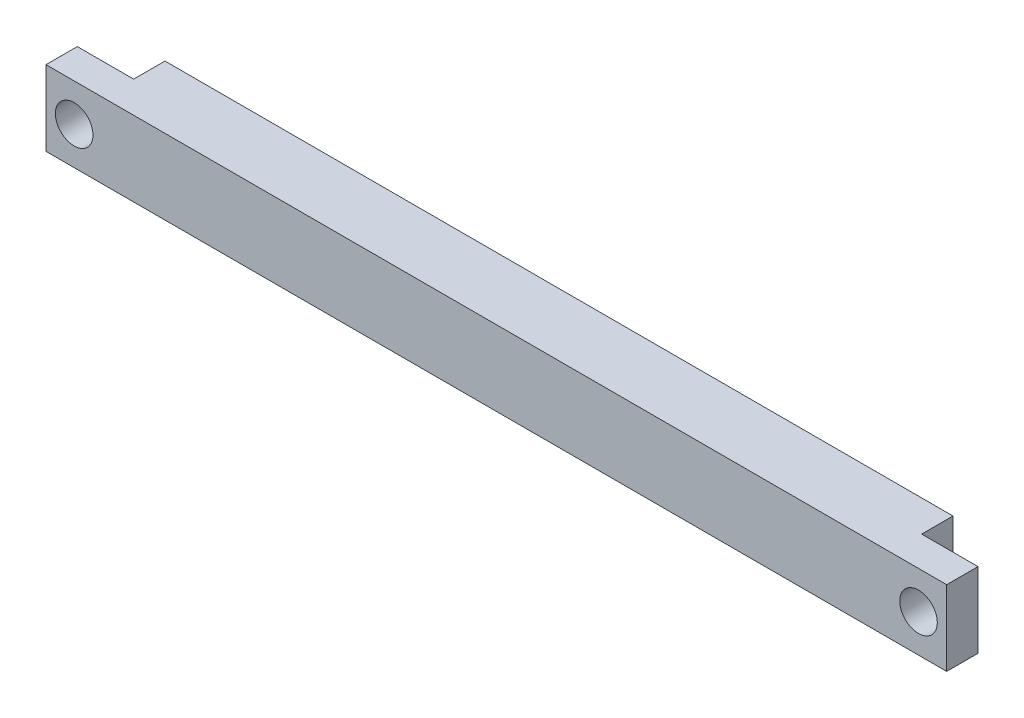
ISO-10303-21;
HEADER;
FILE_DESCRIPTION(('STEP AP214'),'2;1');
FILE_NAME('part.step','',(''),(''),'','','');
FILE_SCHEMA(('AUTOMOTIVE_DESIGN { 1 0 10303 214 1 1 1 1 }'));
ENDSEC;
DATA;
#1=APPLICATION_CONTEXT('core data for automotive mechanical design processes');
#2=APPLICATION_PROTOCOL_DEFINITION('international standard','automotive_design',2000,#1);
#3=PRODUCT_CONTEXT('',#1,'mechanical');
#4=PRODUCT('Part','Part','',(#3));
#5=PRODUCT_RELATED_PRODUCT_CATEGORY('part','',(#4));
#6=PRODUCT_DEFINITION_FORMATION('','',#4);
#7=PRODUCT_DEFINITION_CONTEXT('part definition',#1,'design');
#8=PRODUCT_DEFINITION('design','',#6,#7);
#9=PRODUCT_DEFINITION_SHAPE('','',#8);
#10=(LENGTH_UNIT() NAMED_UNIT(*) SI_UNIT(.MILLI.,.METRE.));
#11=(NAMED_UNIT(*) PLANE_ANGLE_UNIT() SI_UNIT($,.RADIAN.));
#12=(NAMED_UNIT(*) SI_UNIT($,.STERADIAN.) SOLID_ANGLE_UNIT());
#13=UNCERTAINTY_MEASURE_WITH_UNIT(LENGTH_MEASURE(1.E-05),#10,'distance_accuracy_value','');
#14=(GEOMETRIC_REPRESENTATION_CONTEXT(3) GLOBAL_UNCERTAINTY_ASSIGNED_CONTEXT((#13)) GLOBAL_UNIT_ASSIGNED_CONTEXT((#10,
#11,#12)) REPRESENTATION_CONTEXT('',''));
#15=CARTESIAN_POINT('',(0.,0.,0.));
#16=DIRECTION('',(0.,0.,1.));
#17=DIRECTION('',(1.,0.,0.));
#18=AXIS2_PLACEMENT_3D('',#15,#16,#17);
#19=CARTESIAN_POINT('',(0.,0.,0.));
#20=DIRECTION('',(0.,0.,-1.));
#21=DIRECTION('',(-1.,0.,0.));
#22=AXIS2_PLACEMENT_3D('',#19,#20,#21);
#23=PLANE('',#22);
#24=DIRECTION('',(0.,-1.,0.));
#25=VECTOR('',#24,1.);
#26=CARTESIAN_POINT('',(0.,6.,0.));
#27=LINE('',#26,#25);
#28=CARTESIAN_POINT('',(0.,6.,0.));
#29=VERTEX_POINT('',#28);
#30=CARTESIAN_POINT('',(0.,0.,0.));
#31=VERTEX_POINT('',#30);
#32=EDGE_CURVE('E132',#29,#31,#27,.T.);
#33=ORIENTED_EDGE('',*,*,#32,.F.);
#34=DIRECTION('',(-1.,0.,0.));
#35=VECTOR('',#34,1.);
#36=CARTESIAN_POINT('',(-67.4302989722411,6.,0.));
#37=LINE('',#36,#35);
#38=CARTESIAN_POINT('',(4.5,6.,0.));
#39=VERTEX_POINT('',#38);
#40=EDGE_CURVE('E162',#39,#29,#37,.T.);
#41=ORIENTED_EDGE('',*,*,#40,.F.);
#42=DIRECTION('',(0.,1.,0.));
#43=VECTOR('',#42,1.);
#44=CARTESIAN_POINT('',(4.5,0.,0.));
#45=LINE('',#44,#43);
#46=CARTESIAN_POINT('',(4.5,0.,0.));
#47=VERTEX_POINT('',#46);
#48=EDGE_CURVE('E178',#47,#39,#45,.T.);
#49=ORIENTED_EDGE('',*,*,#48,.F.);
#50=DIRECTION('',(1.,0.,0.));
#51=VECTOR('',#50,1.);
#52=CARTESIAN_POINT('',(-67.4302989722411,0.,0.));
#53=LINE('',#52,#51);
#54=EDGE_CURVE('E59',#31,#47,#53,.T.);
#55=ORIENTED_EDGE('',*,*,#54,.F.);
#56=EDGE_LOOP('',(#33,#41,#49,#55));
#57=FACE_BOUND('',#56,.T.);
#58=CARTESIAN_POINT('',(2.25,3.,0.));
#59=DIRECTION('',(0.,0.,1.));
#60=DIRECTION('',(1.,0.,0.));
#61=AXIS2_PLACEMENT_3D('',#58,#59,#60);
#62=CIRCLE('',#61,1.5);
#63=CARTESIAN_POINT('',(3.75,3.,0.));
#64=VERTEX_POINT('',#63);
#65=EDGE_CURVE('E145',#64,#64,#62,.T.);
#66=ORIENTED_EDGE('',*,*,#65,.T.);
#67=EDGE_LOOP('',(#66));
#68=FACE_BOUND('',#67,.T.);
#69=ADVANCED_FACE('F43',(#57,#68),#23,.T.);
#70=CARTESIAN_POINT('',(-67.4302989722411,0.,2.5));
#71=DIRECTION('',(1.,0.,0.));
#72=DIRECTION('',(0.,0.,-1.));
#73=AXIS2_PLACEMENT_3D('',#70,#71,#72);
#74=PLANE('',#73);
#75=DIRECTION('',(0.,-1.,0.));
#76=VECTOR('',#75,1.);
#77=CARTESIAN_POINT('',(-67.4302989722411,0.,0.));
#78=LINE('',#77,#76);
#79=CARTESIAN_POINT('',(-67.4302989722411,6.,0.));
#80=VERTEX_POINT('',#79);
#81=CARTESIAN_POINT('',(-67.4302989722411,0.,0.));
#82=VERTEX_POINT('',#81);
#83=EDGE_CURVE('E149',#80,#82,#78,.T.);
#84=ORIENTED_EDGE('',*,*,#83,.T.);
#85=DIRECTION('',(0.,0.,-1.));
#86=VECTOR('',#85,1.);
#87=CARTESIAN_POINT('',(-67.4302989722411,0.,2.5));
#88=LINE('',#87,#86);
#89=CARTESIAN_POINT('',(-67.4302989722411,0.,2.5));
#90=VERTEX_POINT('',#89);
#91=EDGE_CURVE('E11',#90,#82,#88,.T.);
#92=ORIENTED_EDGE('',*,*,#91,.F.);
#93=DIRECTION('',(0.,-1.,0.));
#94=VECTOR('',#93,1.);
#95=CARTESIAN_POINT('',(-67.4302989722411,0.,2.5));
#96=LINE('',#95,#94);
#97=CARTESIAN_POINT('',(-67.4302989722411,6.,2.5));
#98=VERTEX_POINT('',#97);
#99=EDGE_CURVE('E157',#98,#90,#96,.T.);
#100=ORIENTED_EDGE('',*,*,#99,.F.);
#101=DIRECTION('',(0.,0.,-1.));
#102=VECTOR('',#101,1.);
#103=CARTESIAN_POINT('',(-67.4302989722411,6.,2.5));
#104=LINE('',#103,#102);
#105=EDGE_CURVE('E171',#98,#80,#104,.T.);
#106=ORIENTED_EDGE('',*,*,#105,.T.);
#107=EDGE_LOOP('',(#84,#92,#100,#106));
#108=FACE_BOUND('',#107,.T.);
#109=ADVANCED_FACE('F45',(#108),#74,.F.);
#110=CARTESIAN_POINT('',(-67.4302989722411,0.,2.5));
#111=DIRECTION('',(0.,1.,0.));
#112=DIRECTION('',(0.,0.,1.));
#113=AXIS2_PLACEMENT_3D('',#110,#111,#112);
#114=PLANE('',#113);
#115=CARTESIAN_POINT('',(-62.9302989722411,0.,0.));
#116=VERTEX_POINT('',#115);
#117=EDGE_CURVE('E175',#82,#116,#53,.T.);
#118=ORIENTED_EDGE('',*,*,#117,.T.);
#119=DIRECTION('',(0.,0.,1.));
#120=VECTOR('',#119,1.);
#121=CARTESIAN_POINT('',(-62.9302989722411,0.,-2.5));
#122=LINE('',#121,#120);
#123=CARTESIAN_POINT('',(-62.9302989722411,0.,-2.5));
#124=VERTEX_POINT('',#123);
#125=EDGE_CURVE('E115',#124,#116,#122,.T.);
#126=ORIENTED_EDGE('',*,*,#125,.F.);
#127=DIRECTION('',(-1.,0.,0.));
#128=VECTOR('',#127,1.);
#129=CARTESIAN_POINT('',(0.,0.,-2.5));
#130=LINE('',#129,#128);
#131=CARTESIAN_POINT('',(0.,0.,-2.5));
#132=VERTEX_POINT('',#131);
#133=EDGE_CURVE('E108',#132,#124,#130,.T.);
#134=ORIENTED_EDGE('',*,*,#133,.F.);
#135=DIRECTION('',(0.,0.,1.));
#136=VECTOR('',#135,1.);
#137=CARTESIAN_POINT('',(0.,0.,-2.5));
#138=LINE('',#137,#136);
#139=EDGE_CURVE('E112',#132,#31,#138,.T.);
#140=ORIENTED_EDGE('',*,*,#139,.T.);
#141=ORIENTED_EDGE('',*,*,#54,.T.);
#142=DIRECTION('',(0.,0.,-1.));
#143=VECTOR('',#142,1.);
#144=CARTESIAN_POINT('',(4.5,0.,2.5));
#145=LINE('',#144,#143);
#146=CARTESIAN_POINT('',(4.5,0.,2.5));
#147=VERTEX_POINT('',#146);
#148=EDGE_CURVE('E52',#147,#47,#145,.T.);
#149=ORIENTED_EDGE('',*,*,#148,.F.);
#150=DIRECTION('',(1.,0.,0.));
#151=VECTOR('',#150,1.);
#152=CARTESIAN_POINT('',(-67.4302989722411,0.,2.5));
#153=LINE('',#152,#151);
#154=EDGE_CURVE('E161',#90,#147,#153,.T.);
#155=ORIENTED_EDGE('',*,*,#154,.F.);
#156=ORIENTED_EDGE('',*,*,#91,.T.);
#157=EDGE_LOOP('',(#118,#126,#134,#140,#141,#149,#155,#156));
#158=FACE_BOUND('',#157,.T.);
#159=ADVANCED_FACE('F110',(#158),#114,.F.);
#160=CARTESIAN_POINT('',(4.5,0.,2.5));
#161=DIRECTION('',(-1.,0.,0.));
#162=DIRECTION('',(0.,0.,1.));
#163=AXIS2_PLACEMENT_3D('',#160,#161,#162);
#164=PLANE('',#163);
#165=ORIENTED_EDGE('',*,*,#48,.T.);
#166=DIRECTION('',(0.,0.,-1.));
#167=VECTOR('',#166,1.);
#168=CARTESIAN_POINT('',(4.5,6.,2.5));
#169=LINE('',#168,#167);
#170=CARTESIAN_POINT('',(4.5,6.,2.5));
#171=VERTEX_POINT('',#170);
#172=EDGE_CURVE('E188',#171,#39,#169,.T.);
#173=ORIENTED_EDGE('',*,*,#172,.F.);
#174=DIRECTION('',(0.,1.,0.));
#175=VECTOR('',#174,1.);
#176=CARTESIAN_POINT('',(4.5,0.,2.5));
#177=LINE('',#176,#175);
#178=EDGE_CURVE('E165',#147,#171,#177,.T.);
#179=ORIENTED_EDGE('',*,*,#178,.F.);
#180=ORIENTED_EDGE('',*,*,#148,.T.);
#181=EDGE_LOOP('',(#165,#173,#179,#180));
#182=FACE_BOUND('',#181,.T.);
#183=ADVANCED_FACE('F196',(#182),#164,.F.);
#184=CARTESIAN_POINT('',(-67.4302989722411,6.,2.5));
#185=DIRECTION('',(0.,-1.,0.));
#186=DIRECTION('',(0.,0.,-1.));
#187=AXIS2_PLACEMENT_3D('',#184,#185,#186);
#188=PLANE('',#187);
#189=ORIENTED_EDGE('',*,*,#40,.T.);
#190=DIRECTION('',(0.,0.,1.));
#191=VECTOR('',#190,1.);
#192=CARTESIAN_POINT('',(0.,6.,-2.5));
#193=LINE('',#192,#191);
#194=CARTESIAN_POINT('',(0.,6.,-2.5));
#195=VERTEX_POINT('',#194);
#196=EDGE_CURVE('E202',#195,#29,#193,.T.);
#197=ORIENTED_EDGE('',*,*,#196,.F.);
#198=DIRECTION('',(1.,0.,0.));
#199=VECTOR('',#198,1.);
#200=CARTESIAN_POINT('',(0.,6.,-2.5));
#201=LINE('',#200,#199);
#202=CARTESIAN_POINT('',(-62.9302989722411,6.,-2.5));
#203=VERTEX_POINT('',#202);
#204=EDGE_CURVE('E125',#203,#195,#201,.T.);
#205=ORIENTED_EDGE('',*,*,#204,.F.);
#206=DIRECTION('',(0.,0.,1.));
#207=VECTOR('',#206,1.);
#208=CARTESIAN_POINT('',(-62.9302989722411,6.,-2.5));
#209=LINE('',#208,#207);
#210=CARTESIAN_POINT('',(-62.9302989722411,6.,0.));
#211=VERTEX_POINT('',#210);
#212=EDGE_CURVE('E141',#203,#211,#209,.T.);
#213=ORIENTED_EDGE('',*,*,#212,.T.);
#214=EDGE_CURVE('E181',#211,#80,#37,.T.);
#215=ORIENTED_EDGE('',*,*,#214,.T.);
#216=ORIENTED_EDGE('',*,*,#105,.F.);
#217=DIRECTION('',(-1.,0.,0.));
#218=VECTOR('',#217,1.);
#219=CARTESIAN_POINT('',(-67.4302989722411,6.,2.5));
#220=LINE('',#219,#218);
#221=EDGE_CURVE('E168',#171,#98,#220,.T.);
#222=ORIENTED_EDGE('',*,*,#221,.F.);
#223=ORIENTED_EDGE('',*,*,#172,.T.);
#224=EDGE_LOOP('',(#189,#197,#205,#213,#215,#216,#222,#223));
#225=FACE_BOUND('',#224,.T.);
#226=ADVANCED_FACE('F201',(#225),#188,.F.);
#227=CARTESIAN_POINT('',(0.,0.,2.5));
#228=DIRECTION('',(0.,0.,-1.));
#229=DIRECTION('',(-1.,0.,0.));
#230=AXIS2_PLACEMENT_3D('',#227,#228,#229);
#231=PLANE('',#230);
#232=CARTESIAN_POINT('',(2.25,3.,2.5));
#233=DIRECTION('',(0.,0.,1.));
#234=DIRECTION('',(1.,0.,0.));
#235=AXIS2_PLACEMENT_3D('',#232,#233,#234);
#236=CIRCLE('',#235,1.5);
#237=CARTESIAN_POINT('',(3.75,3.,2.5));
#238=VERTEX_POINT('',#237);
#239=EDGE_CURVE('E150',#238,#238,#236,.T.);
#240=ORIENTED_EDGE('',*,*,#239,.F.);
#241=EDGE_LOOP('',(#240));
#242=FACE_BOUND('',#241,.T.);
#243=CARTESIAN_POINT('',(-65.1802989722411,3.,2.5));
#244=DIRECTION('',(0.,0.,1.));
#245=DIRECTION('',(1.,0.,0.));
#246=AXIS2_PLACEMENT_3D('',#243,#244,#245);
#247=CIRCLE('',#246,1.5);
#248=CARTESIAN_POINT('',(-63.6802989722411,3.,2.5));
#249=VERTEX_POINT('',#248);
#250=EDGE_CURVE('E139',#249,#249,#247,.T.);
#251=ORIENTED_EDGE('',*,*,#250,.F.);
#252=EDGE_LOOP('',(#251));
#253=FACE_BOUND('',#252,.T.);
#254=ORIENTED_EDGE('',*,*,#99,.T.);
#255=ORIENTED_EDGE('',*,*,#154,.T.);
#256=ORIENTED_EDGE('',*,*,#178,.T.);
#257=ORIENTED_EDGE('',*,*,#221,.T.);
#258=EDGE_LOOP('',(#254,#255,#256,#257));
#259=FACE_BOUND('',#258,.T.);
#260=ADVANCED_FACE('F228',(#242,#253,#259),#231,.F.);
#261=DIRECTION('',(0.,1.,0.));
#262=VECTOR('',#261,1.);
#263=CARTESIAN_POINT('',(-62.9302989722411,6.,0.));
#264=LINE('',#263,#262);
#265=EDGE_CURVE('E67',#116,#211,#264,.T.);
#266=ORIENTED_EDGE('',*,*,#265,.F.);
#267=ORIENTED_EDGE('',*,*,#117,.F.);
#268=ORIENTED_EDGE('',*,*,#83,.F.);
#269=ORIENTED_EDGE('',*,*,#214,.F.);
#270=EDGE_LOOP('',(#266,#267,#268,#269));
#271=FACE_BOUND('',#270,.T.);
#272=CARTESIAN_POINT('',(-65.1802989722411,3.,0.));
#273=DIRECTION('',(0.,0.,1.));
#274=DIRECTION('',(1.,0.,0.));
#275=AXIS2_PLACEMENT_3D('',#272,#273,#274);
#276=CIRCLE('',#275,1.5);
#277=CARTESIAN_POINT('',(-63.6802989722411,3.,0.));
#278=VERTEX_POINT('',#277);
#279=EDGE_CURVE('E134',#278,#278,#276,.T.);
#280=ORIENTED_EDGE('',*,*,#279,.T.);
#281=EDGE_LOOP('',(#280));
#282=FACE_BOUND('',#281,.T.);
#283=ADVANCED_FACE('F225',(#271,#282),#23,.T.);
#284=CARTESIAN_POINT('',(-65.1802989722411,3.,0.));
#285=DIRECTION('',(0.,0.,1.));
#286=DIRECTION('',(1.,0.,0.));
#287=AXIS2_PLACEMENT_3D('',#284,#285,#286);
#288=CYLINDRICAL_SURFACE('',#287,1.5);
#289=ORIENTED_EDGE('',*,*,#279,.F.);
#290=EDGE_LOOP('',(#289));
#291=FACE_BOUND('',#290,.T.);
#292=ORIENTED_EDGE('',*,*,#250,.T.);
#293=EDGE_LOOP('',(#292));
#294=FACE_BOUND('',#293,.T.);
#295=ADVANCED_FACE('F236',(#291,#294),#288,.F.);
#296=CARTESIAN_POINT('',(2.25,3.,0.));
#297=DIRECTION('',(0.,0.,1.));
#298=DIRECTION('',(1.,0.,0.));
#299=AXIS2_PLACEMENT_3D('',#296,#297,#298);
#300=CYLINDRICAL_SURFACE('',#299,1.5);
#301=ORIENTED_EDGE('',*,*,#65,.F.);
#302=EDGE_LOOP('',(#301));
#303=FACE_BOUND('',#302,.T.);
#304=ORIENTED_EDGE('',*,*,#239,.T.);
#305=EDGE_LOOP('',(#304));
#306=FACE_BOUND('',#305,.T.);
#307=ADVANCED_FACE('F281',(#303,#306),#300,.F.);
#308=CARTESIAN_POINT('',(0.,6.,-2.5));
#309=DIRECTION('',(-1.,0.,0.));
#310=DIRECTION('',(0.,0.,1.));
#311=AXIS2_PLACEMENT_3D('',#308,#309,#310);
#312=PLANE('',#311);
#313=ORIENTED_EDGE('',*,*,#32,.T.);
#314=ORIENTED_EDGE('',*,*,#139,.F.);
#315=DIRECTION('',(0.,-1.,0.));
#316=VECTOR('',#315,1.);
#317=CARTESIAN_POINT('',(0.,6.,-2.5));
#318=LINE('',#317,#316);
#319=EDGE_CURVE('E120',#195,#132,#318,.T.);
#320=ORIENTED_EDGE('',*,*,#319,.F.);
#321=ORIENTED_EDGE('',*,*,#196,.T.);
#322=EDGE_LOOP('',(#313,#314,#320,#321));
#323=FACE_BOUND('',#322,.T.);
#324=ADVANCED_FACE('F131',(#323),#312,.F.);
#325=CARTESIAN_POINT('',(-62.9302989722411,6.,-2.5));
#326=DIRECTION('',(1.,0.,0.));
#327=DIRECTION('',(0.,0.,-1.));
#328=AXIS2_PLACEMENT_3D('',#325,#326,#327);
#329=PLANE('',#328);
#330=ORIENTED_EDGE('',*,*,#265,.T.);
#331=ORIENTED_EDGE('',*,*,#212,.F.);
#332=DIRECTION('',(0.,1.,0.));
#333=VECTOR('',#332,1.);
#334=CARTESIAN_POINT('',(-62.9302989722411,6.,-2.5));
#335=LINE('',#334,#333);
#336=EDGE_CURVE('E119',#124,#203,#335,.T.);
#337=ORIENTED_EDGE('',*,*,#336,.F.);
#338=ORIENTED_EDGE('',*,*,#125,.T.);
#339=EDGE_LOOP('',(#330,#331,#337,#338));
#340=FACE_BOUND('',#339,.T.);
#341=ADVANCED_FACE('F218',(#340),#329,.F.);
#342=CARTESIAN_POINT('',(0.,0.,-2.5));
#343=DIRECTION('',(0.,0.,-1.));
#344=DIRECTION('',(-1.,0.,0.));
#345=AXIS2_PLACEMENT_3D('',#342,#343,#344);
#346=PLANE('',#345);
#347=ORIENTED_EDGE('',*,*,#319,.T.);
#348=ORIENTED_EDGE('',*,*,#133,.T.);
#349=ORIENTED_EDGE('',*,*,#336,.T.);
#350=ORIENTED_EDGE('',*,*,#204,.T.);
#351=EDGE_LOOP('',(#347,#348,#349,#350));
#352=FACE_BOUND('',#351,.T.);
#353=ADVANCED_FACE('F123',(#352),#346,.T.);
#354=CLOSED_SHELL('',(#69,#109,#159,#183,#226,#260,#283,#295,#307,#324,#341,#353));
#355=MANIFOLD_SOLID_BREP('B2',#354);
#356=ADVANCED_BREP_SHAPE_REPRESENTATION('',(#18,#355),#14);
#357=SHAPE_DEFINITION_REPRESENTATION(#9,#356);
ENDSEC;
END-ISO-10303-21;
